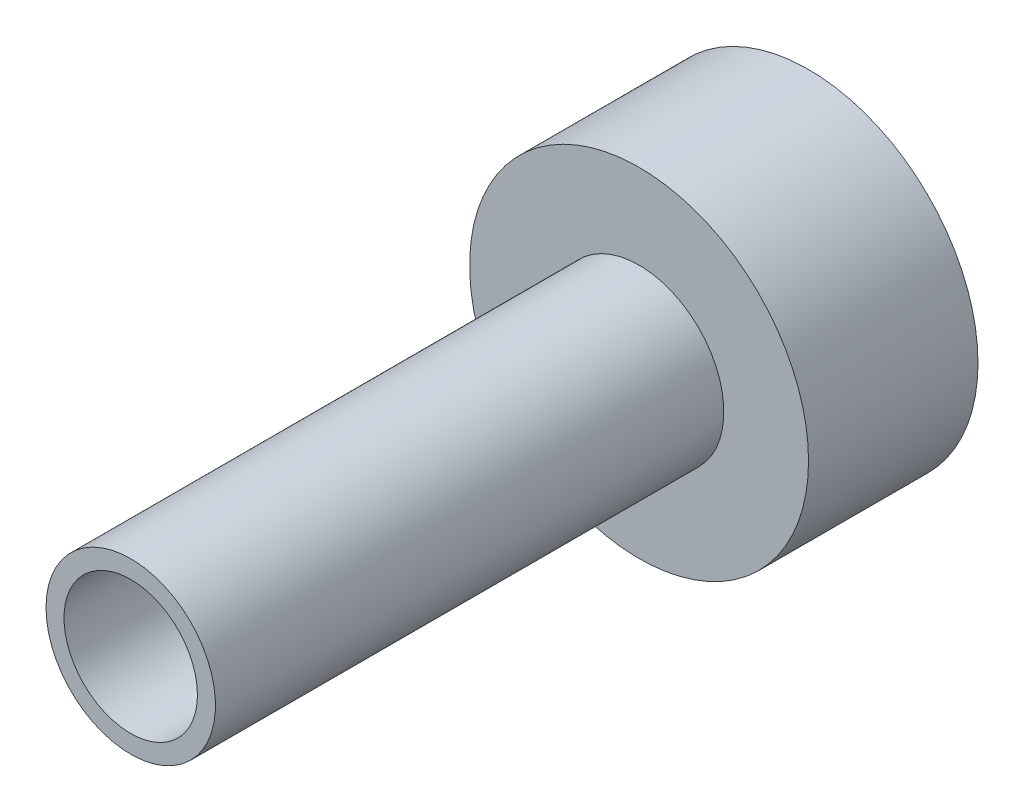
ISO-10303-21;
HEADER;
FILE_DESCRIPTION(('STEP AP214'),'2;1');
FILE_NAME('part.step','',(''),(''),'','','');
FILE_SCHEMA(('AUTOMOTIVE_DESIGN { 1 0 10303 214 1 1 1 1 }'));
ENDSEC;
DATA;
#1=APPLICATION_CONTEXT('core data for automotive mechanical design processes');
#2=APPLICATION_PROTOCOL_DEFINITION('international standard','automotive_design',2000,#1);
#3=PRODUCT_CONTEXT('',#1,'mechanical');
#4=PRODUCT('Part','Part','',(#3));
#5=PRODUCT_RELATED_PRODUCT_CATEGORY('part','',(#4));
#6=PRODUCT_DEFINITION_FORMATION('','',#4);
#7=PRODUCT_DEFINITION_CONTEXT('part definition',#1,'design');
#8=PRODUCT_DEFINITION('design','',#6,#7);
#9=PRODUCT_DEFINITION_SHAPE('','',#8);
#10=(LENGTH_UNIT() NAMED_UNIT(*) SI_UNIT(.MILLI.,.METRE.));
#11=(NAMED_UNIT(*) PLANE_ANGLE_UNIT() SI_UNIT($,.RADIAN.));
#12=(NAMED_UNIT(*) SI_UNIT($,.STERADIAN.) SOLID_ANGLE_UNIT());
#13=UNCERTAINTY_MEASURE_WITH_UNIT(LENGTH_MEASURE(1.E-05),#10,'distance_accuracy_value','');
#14=(GEOMETRIC_REPRESENTATION_CONTEXT(3) GLOBAL_UNCERTAINTY_ASSIGNED_CONTEXT((#13)) GLOBAL_UNIT_ASSIGNED_CONTEXT((#10,
#11,#12)) REPRESENTATION_CONTEXT('',''));
#15=CARTESIAN_POINT('',(0.,0.,0.));
#16=DIRECTION('',(0.,0.,1.));
#17=DIRECTION('',(1.,0.,0.));
#18=AXIS2_PLACEMENT_3D('',#15,#16,#17);
#19=CARTESIAN_POINT('',(0.,0.,6.35));
#20=DIRECTION('',(0.,0.,1.));
#21=DIRECTION('',(1.,0.,0.));
#22=AXIS2_PLACEMENT_3D('',#19,#20,#21);
#23=PLANE('',#22);
#24=CARTESIAN_POINT('',(0.,0.,6.35));
#25=DIRECTION('',(0.,0.,1.));
#26=DIRECTION('',(1.,0.,0.));
#27=AXIS2_PLACEMENT_3D('',#24,#25,#26);
#28=CIRCLE('',#27,6.35);
#29=CARTESIAN_POINT('',(6.35,0.,6.35));
#30=VERTEX_POINT('',#29);
#31=EDGE_CURVE('E46',#30,#30,#28,.T.);
#32=ORIENTED_EDGE('',*,*,#31,.T.);
#33=EDGE_LOOP('',(#32));
#34=FACE_BOUND('',#33,.T.);
#35=CARTESIAN_POINT('',(0.,0.,6.35));
#36=DIRECTION('',(0.,0.,1.));
#37=DIRECTION('',(1.,0.,0.));
#38=AXIS2_PLACEMENT_3D('',#35,#36,#37);
#39=CIRCLE('',#38,3.175);
#40=CARTESIAN_POINT('',(-3.175,0.,6.35));
#41=VERTEX_POINT('',#40);
#42=EDGE_CURVE('E60',#41,#41,#39,.T.);
#43=ORIENTED_EDGE('',*,*,#42,.F.);
#44=EDGE_LOOP('',(#43));
#45=FACE_BOUND('',#44,.T.);
#46=ADVANCED_FACE('F35',(#34,#45),#23,.T.);
#47=CARTESIAN_POINT('',(0.,0.,0.));
#48=DIRECTION('',(0.,0.,1.));
#49=DIRECTION('',(1.,0.,0.));
#50=AXIS2_PLACEMENT_3D('',#47,#48,#49);
#51=PLANE('',#50);
#52=CARTESIAN_POINT('',(0.,0.,0.));
#53=DIRECTION('',(0.,0.,1.));
#54=DIRECTION('',(1.,0.,0.));
#55=AXIS2_PLACEMENT_3D('',#52,#53,#54);
#56=CIRCLE('',#55,6.35);
#57=CARTESIAN_POINT('',(6.35,0.,0.));
#58=VERTEX_POINT('',#57);
#59=EDGE_CURVE('E50',#58,#58,#56,.T.);
#60=ORIENTED_EDGE('',*,*,#59,.F.);
#61=EDGE_LOOP('',(#60));
#62=FACE_BOUND('',#61,.T.);
#63=CARTESIAN_POINT('',(0.,0.,0.));
#64=DIRECTION('',(0.,0.,1.));
#65=DIRECTION('',(1.,0.,0.));
#66=AXIS2_PLACEMENT_3D('',#63,#64,#65);
#67=CIRCLE('',#66,2.5);
#68=CARTESIAN_POINT('',(2.5,0.,0.));
#69=VERTEX_POINT('',#68);
#70=EDGE_CURVE('E55',#69,#69,#67,.T.);
#71=ORIENTED_EDGE('',*,*,#70,.T.);
#72=EDGE_LOOP('',(#71));
#73=FACE_BOUND('',#72,.T.);
#74=ADVANCED_FACE('F94',(#62,#73),#51,.F.);
#75=CARTESIAN_POINT('',(0.,0.,6.35));
#76=DIRECTION('',(0.,0.,-1.));
#77=DIRECTION('',(-1.,0.,0.));
#78=AXIS2_PLACEMENT_3D('',#75,#76,#77);
#79=CYLINDRICAL_SURFACE('',#78,6.35);
#80=CARTESIAN_POINT('',(-6.35,0.,4.32190817375387));
#81=CARTESIAN_POINT('',(-6.3499988839214,-0.0629563878791096,4.32190570961263));
#82=CARTESIAN_POINT('',(-6.34905403128448,-0.125945518180089,4.31663050555598));
#83=CARTESIAN_POINT('',(-6.34537585531729,-0.250152702081869,4.29568038867684));
#84=CARTESIAN_POINT('',(-6.34264095902063,-0.31136914852081,4.27999632910353));
#85=CARTESIAN_POINT('',(-6.33568901554255,-0.430216353374725,4.23872073438084));
#86=CARTESIAN_POINT('',(-6.33147324821675,-0.48785015765638,4.21313775252846));
#87=CARTESIAN_POINT('',(-6.32202140996736,-0.598001091171562,4.15281393416416));
#88=CARTESIAN_POINT('',(-6.31678543757031,-0.650518713767407,4.11807398187448));
#89=CARTESIAN_POINT('',(-6.3058088163252,-0.749522216487122,4.04002211357387));
#90=CARTESIAN_POINT('',(-6.30006376112309,-0.795944583557266,3.99663024677148));
#91=CARTESIAN_POINT('',(-6.28874965760556,-0.880890742796282,3.90267833023243));
#92=CARTESIAN_POINT('',(-6.28318062121278,-0.919414000884793,3.85211779619324));
#93=CARTESIAN_POINT('',(-6.27280636489556,-0.987728082473348,3.74482077108546));
#94=CARTESIAN_POINT('',(-6.26800683286247,-1.01745513923004,3.68804308273011));
#95=CARTESIAN_POINT('',(-6.25977667220809,-1.0669249737415,3.57020006709602));
#96=CARTESIAN_POINT('',(-6.25634593766797,-1.08666852406106,3.50913507200331));
#97=CARTESIAN_POINT('',(-6.2512859511231,-1.11540879351234,3.38512755160419));
#98=CARTESIAN_POINT('',(-6.24963823052388,-1.12451576700911,3.32221134730215));
#99=CARTESIAN_POINT('',(-6.24827506974414,-1.13206641649241,3.19572400111501));
#100=CARTESIAN_POINT('',(-6.24855947354512,-1.13051095346756,3.13215291252554));
#101=CARTESIAN_POINT('',(-6.25101158981713,-1.11687047479473,3.00695358118695));
#102=CARTESIAN_POINT('',(-6.25315700585985,-1.10491011333064,2.94531125660436));
#103=CARTESIAN_POINT('',(-6.25905444840308,-1.07099533738572,2.82492235902611));
#104=CARTESIAN_POINT('',(-6.26280653702217,-1.049040536489,2.76617589809082));
#105=CARTESIAN_POINT('',(-6.2715182331776,-0.995636097085759,2.65287762972726));
#106=CARTESIAN_POINT('',(-6.27648429874685,-0.964135455052854,2.59835038042863));
#107=CARTESIAN_POINT('',(-6.28706003112924,-0.892569656940644,2.49530848978844));
#108=CARTESIAN_POINT('',(-6.29266975697482,-0.852503715015034,2.44679440078595));
#109=CARTESIAN_POINT('',(-6.3039982759432,-0.764269222158468,2.35643510913641));
#110=CARTESIAN_POINT('',(-6.30971748810976,-0.715993892439711,2.3146941568001));
#111=CARTESIAN_POINT('',(-6.32054731368641,-0.613070078093335,2.23988845968553));
#112=CARTESIAN_POINT('',(-6.32565792208253,-0.558421540967503,2.20682378638393));
#113=CARTESIAN_POINT('',(-6.33470353710574,-0.444198884642506,2.15029664891139));
#114=CARTESIAN_POINT('',(-6.33863730921633,-0.384619676136645,2.12684425867615));
#115=CARTESIAN_POINT('',(-6.34487632476616,-0.262282092255564,2.09030873282734));
#116=CARTESIAN_POINT('',(-6.34718172386837,-0.199524021375927,2.07722460605358));
#117=CARTESIAN_POINT('',(-6.34988306770141,-0.0735078508517706,2.06194034334128));
#118=CARTESIAN_POINT('',(-6.35030409228237,-0.0102676109126,2.05959724081418));
#119=CARTESIAN_POINT('',(-6.34925825163245,0.115701348621398,2.06547914491534));
#120=CARTESIAN_POINT('',(-6.34779146965248,0.17843009065015,2.07370368551821));
#121=CARTESIAN_POINT('',(-6.34315039678748,0.301147522772469,2.10036851617878));
#122=CARTESIAN_POINT('',(-6.33998807934095,0.361152264520321,2.11873719786243));
#123=CARTESIAN_POINT('',(-6.33230904006331,0.477230535073567,2.16509194347609));
#124=CARTESIAN_POINT('',(-6.32779223354356,0.533303817796236,2.19307860878086));
#125=CARTESIAN_POINT('',(-6.31784277068134,0.640542721018922,2.25819647381568));
#126=CARTESIAN_POINT('',(-6.31240144327334,0.691653918516031,2.29541594846123));
#127=CARTESIAN_POINT('',(-6.30123054524762,0.78695626008388,2.37782253373787));
#128=CARTESIAN_POINT('',(-6.29550095057328,0.831146825340834,2.42301031013437));
#129=CARTESIAN_POINT('',(-6.28431705815892,0.911890524213835,2.52071525694072));
#130=CARTESIAN_POINT('',(-6.27886684675114,0.948346537135833,2.57331323185442));
#131=CARTESIAN_POINT('',(-6.26893820466268,1.01190558831821,2.68397062891774));
#132=CARTESIAN_POINT('',(-6.2644597402094,1.03900895164483,2.74202986116337));
#133=CARTESIAN_POINT('',(-6.25701307344201,1.08295206493416,2.86170339315579));
#134=CARTESIAN_POINT('',(-6.25403806705126,1.09983812432205,2.9233002456087));
#135=CARTESIAN_POINT('',(-6.24991887731239,1.12301156564012,3.04851408924664));
#136=CARTESIAN_POINT('',(-6.24877450994984,1.12930001283747,3.11213087673367));
#137=CARTESIAN_POINT('',(-6.24845484979012,1.13106684825176,3.23860738945719));
#138=CARTESIAN_POINT('',(-6.24925168135855,1.12669827021579,3.30146495804851));
#139=CARTESIAN_POINT('',(-6.25266316282823,1.10760816297116,3.42553492981796));
#140=CARTESIAN_POINT('',(-6.25527780432067,1.09288668165289,3.4867473406049));
#141=CARTESIAN_POINT('',(-6.26201909575184,1.05357047523371,3.60571793427834));
#142=CARTESIAN_POINT('',(-6.26614345047997,1.02899073220675,3.66348120663358));
#143=CARTESIAN_POINT('',(-6.27544134328701,0.970671955669598,3.77408873184795));
#144=CARTESIAN_POINT('',(-6.28061494523719,0.936932364525778,3.82693268496544));
#145=CARTESIAN_POINT('',(-6.29151580295166,0.860712930365976,3.92697125118184));
#146=CARTESIAN_POINT('',(-6.29724959616527,0.818121129276667,3.97407986458786));
#147=CARTESIAN_POINT('',(-6.30857437800572,0.725641135508031,4.06053299191055));
#148=CARTESIAN_POINT('',(-6.31416533347806,0.675751266606113,4.09987571726529));
#149=CARTESIAN_POINT('',(-6.32462666894718,0.569614887399337,4.16997142935248));
#150=CARTESIAN_POINT('',(-6.32949092933148,0.513320736215191,4.20065321225178));
#151=CARTESIAN_POINT('',(-6.3378912214025,0.39631076881733,4.25207585492785));
#152=CARTESIAN_POINT('',(-6.34142853555049,0.335599289969209,4.27282631846293));
#153=CARTESIAN_POINT('',(-6.34603119498659,0.228901192837832,4.29944657052336));
#154=CARTESIAN_POINT('',(-6.3475113052666,0.183549007984973,4.30785570768228));
#155=CARTESIAN_POINT('',(-6.34949610579554,0.0921370516835602,4.31908735146152));
#156=CARTESIAN_POINT('',(-6.35000081684933,0.0460772953483361,4.32190997723986));
#157=CARTESIAN_POINT('',(-6.35,0.,4.32190817375387));
#158=B_SPLINE_CURVE_WITH_KNOTS('',3,(#80,#81,#82,#83,#84,#85,#86,#87,#88,#89,#90,#91,#92,#93,
#94,#95,#96,#97,#98,#99,#100,#101,#102,#103,#104,#105,#106,#107,#108,#109,#110,#111,#112,#113,
#114,#115,#116,#117,#118,#119,#120,#121,#122,#123,#124,#125,#126,#127,#128,#129,#130,#131,#132,
#133,#134,#135,#136,#137,#138,#139,#140,#141,#142,#143,#144,#145,#146,#147,#148,#149,#150,#151,
#152,#153,#154,#155,#156,#157),.UNSPECIFIED.,.T.,.F.,(4,2,2,2,2,2,2,2,2,2,2,2,2,2,2,2,2,2,2,2,2,
2,2,2,2,2,2,2,2,2,2,2,2,2,2,2,2,2,4),(0.,0.188700695089458,0.377567430304385,0.566271335794905,
0.754957026188634,0.945474674221974,1.13600519943006,1.32788488763882,1.51974972513488,
1.70960760659306,1.89945015726348,2.08704917225956,2.27465544102885,2.4632823148854,
2.65192650225096,2.84324403808116,3.03456314996839,3.22608225995457,3.41758305935036,
3.6065273740334,3.79546335669534,3.98308236329304,4.17071310310582,4.36021202617093,
4.5497267897079,4.74149628669667,4.93325911775941,5.1241461524447,5.31501399810743,
5.50315717677205,5.69129948513105,5.879156941514,6.06702583685678,6.25743369109013,
6.44788534712722,6.63985995513198,6.8316485433784,6.96976007448539,7.1078686596979),.UNSPECIFIED.);
#159=CARTESIAN_POINT('',(-6.35,0.,4.32190817375387));
#160=VERTEX_POINT('',#159);
#161=EDGE_CURVE('E10',#160,#160,#158,.T.);
#162=ORIENTED_EDGE('',*,*,#161,.T.);
#163=EDGE_LOOP('',(#162));
#164=FACE_BOUND('',#163,.T.);
#165=ORIENTED_EDGE('',*,*,#31,.F.);
#166=EDGE_LOOP('',(#165));
#167=FACE_BOUND('',#166,.T.);
#168=ORIENTED_EDGE('',*,*,#59,.T.);
#169=EDGE_LOOP('',(#168));
#170=FACE_BOUND('',#169,.T.);
#171=ADVANCED_FACE('F37',(#164,#167,#170),#79,.T.);
#172=CARTESIAN_POINT('',(0.,0.,6.35));
#173=DIRECTION('',(0.,0.,-1.));
#174=DIRECTION('',(-1.,0.,0.));
#175=AXIS2_PLACEMENT_3D('',#172,#173,#174);
#176=CYLINDRICAL_SURFACE('',#175,2.5);
#177=CARTESIAN_POINT('',(-2.5,0.,4.32190817375387));
#178=CARTESIAN_POINT('',(-2.49999753532052,-0.0600822781699421,4.32190519010651));
#179=CARTESIAN_POINT('',(-2.49780998569268,-0.120255579793321,4.31708934999698));
#180=CARTESIAN_POINT('',(-2.48927659139313,-0.238864936200406,4.29801966384634));
#181=CARTESIAN_POINT('',(-2.48292101568391,-0.297296590206035,4.28374373062889));
#182=CARTESIAN_POINT('',(-2.46672504100596,-0.410519737980339,4.24640262474459));
#183=CARTESIAN_POINT('',(-2.45689724977841,-0.465323560820436,4.22336922800749));
#184=CARTESIAN_POINT('',(-2.43469105852836,-0.570226447848531,4.16931185872671));
#185=CARTESIAN_POINT('',(-2.42231318685542,-0.620326483486105,4.13828954107022));
#186=CARTESIAN_POINT('',(-2.39542952734409,-0.717343781540012,4.06727692519043));
#187=CARTESIAN_POINT('',(-2.38084643173633,-0.763958808348631,4.02690331522822));
#188=CARTESIAN_POINT('',(-2.35149528944333,-0.85002441305893,3.93914926029241));
#189=CARTESIAN_POINT('',(-2.33672713461405,-0.889470570876482,3.89176452493358));
#190=CARTESIAN_POINT('',(-2.30766976105589,-0.962442756535043,3.7878865205287));
#191=CARTESIAN_POINT('',(-2.29346302025365,-0.995468844501712,3.73101645276735));
#192=CARTESIAN_POINT('',(-2.26839208577814,-1.05135258954231,3.61180105394154));
#193=CARTESIAN_POINT('',(-2.25752587849092,-1.07421637599037,3.54945905051372));
#194=CARTESIAN_POINT('',(-2.24121806115519,-1.10782476642698,3.42453796049981));
#195=CARTESIAN_POINT('',(-2.2355162032548,-1.11915487795904,3.36215183942219));
#196=CARTESIAN_POINT('',(-2.22945167708961,-1.1311921664553,3.2361239151627));
#197=CARTESIAN_POINT('',(-2.22908524805582,-1.13190682591099,3.17248302811167));
#198=CARTESIAN_POINT('',(-2.23351683738998,-1.12312848632354,3.05210850312616));
#199=CARTESIAN_POINT('',(-2.23783618785691,-1.11458166981261,2.9952844200852));
#200=CARTESIAN_POINT('',(-2.25033149246957,-1.08913130633431,2.88398601822338));
#201=CARTESIAN_POINT('',(-2.25850835374474,-1.07222579369702,2.82951225539253));
#202=CARTESIAN_POINT('',(-2.27798715558767,-1.03020341851955,2.7229781944985));
#203=CARTESIAN_POINT('',(-2.28935580707384,-1.00490890992585,2.67100072538614));
#204=CARTESIAN_POINT('',(-2.31392853665228,-0.946955134909239,2.57180380481031));
#205=CARTESIAN_POINT('',(-2.3271333978298,-0.914292722591361,2.52458639826138));
#206=CARTESIAN_POINT('',(-2.3555119211023,-0.838661167836849,2.43122030766581));
#207=CARTESIAN_POINT('',(-2.37074960054508,-0.794983554799028,2.3856631791026));
#208=CARTESIAN_POINT('',(-2.40036815772633,-0.700488055365266,2.3023018525865));
#209=CARTESIAN_POINT('',(-2.41474875734216,-0.649667868974443,2.26450016166099));
#210=CARTESIAN_POINT('',(-2.441595329966,-0.540258539490566,2.19663624599657));
#211=CARTESIAN_POINT('',(-2.45398660301872,-0.481474906305864,2.16685575397384));
#212=CARTESIAN_POINT('',(-2.4748626594719,-0.359027896950457,2.1178212427441));
#213=CARTESIAN_POINT('',(-2.48334999142515,-0.295367736011091,2.09856035463438));
#214=CARTESIAN_POINT('',(-2.49495947814047,-0.169881134337021,2.07244478053609));
#215=CARTESIAN_POINT('',(-2.49842301024102,-0.10825106057275,2.06479882868542));
#216=CARTESIAN_POINT('',(-2.50071674189136,0.0155054827584758,2.05972085475632));
#217=CARTESIAN_POINT('',(-2.49954858951989,0.0776317679084565,2.06228519957925));
#218=CARTESIAN_POINT('',(-2.49292468795018,0.196637407064394,2.07702778069765));
#219=CARTESIAN_POINT('',(-2.48773299827167,0.25360660526838,2.08861412955853));
#220=CARTESIAN_POINT('',(-2.47388829633388,0.364708953054158,2.12020615681207));
#221=CARTESIAN_POINT('',(-2.46523486864258,0.418841761367811,2.14021284571758));
#222=CARTESIAN_POINT('',(-2.44494100839571,0.524649476351218,2.18870559194826));
#223=CARTESIAN_POINT('',(-2.43321610703453,0.576195720898968,2.21743583748114));
#224=CARTESIAN_POINT('',(-2.40798300337697,0.673920744470044,2.28229406571106));
#225=CARTESIAN_POINT('',(-2.39447402094728,0.72009715869568,2.31842528849773));
#226=CARTESIAN_POINT('',(-2.365711336932,0.809820978251054,2.40055360346166));
#227=CARTESIAN_POINT('',(-2.35040593918311,0.852830990637241,2.44712105848629));
#228=CARTESIAN_POINT('',(-2.32070956290476,0.930615104407229,2.54698320310193));
#229=CARTESIAN_POINT('',(-2.30631894715077,0.965385953108912,2.60028053684914));
#230=CARTESIAN_POINT('',(-2.27978800760565,1.0265035925915,2.71396852220422));
#231=CARTESIAN_POINT('',(-2.26771717388814,1.05260357478991,2.77450936616503));
#232=CARTESIAN_POINT('',(-2.24805111549491,1.09398365543882,2.899851817901));
#233=CARTESIAN_POINT('',(-2.24045131482283,1.10927481970081,2.96464899362599));
#234=CARTESIAN_POINT('',(-2.23137234406808,1.12741784093358,3.09061722594103));
#235=CARTESIAN_POINT('',(-2.22941953274959,1.13123346685628,3.1516154203954));
#236=CARTESIAN_POINT('',(-2.23056169824744,1.12898055369407,3.27337343592874));
#237=CARTESIAN_POINT('',(-2.23365549278361,1.12291432965375,3.33413330949713));
#238=CARTESIAN_POINT('',(-2.24407859716409,1.10192249763591,3.44961768807222));
#239=CARTESIAN_POINT('',(-2.25112244914719,1.08759230069689,3.50447893194039));
#240=CARTESIAN_POINT('',(-2.26838018341276,1.05112132051272,3.61100540452354));
#241=CARTESIAN_POINT('',(-2.27859499046872,1.02897825847537,3.66266969560457));
#242=CARTESIAN_POINT('',(-2.3018625679474,0.975868743486251,3.76501499748917));
#243=CARTESIAN_POINT('',(-2.31505655938752,0.944422675042858,3.81541426710497));
#244=CARTESIAN_POINT('',(-2.34247247324534,0.874209588312668,3.91051912175575));
#245=CARTESIAN_POINT('',(-2.35669484178566,0.835439380820094,3.95522221220731));
#246=CARTESIAN_POINT('',(-2.38613100197327,0.747475338300104,4.04190938965517));
#247=CARTESIAN_POINT('',(-2.40131593750279,0.697651312674878,4.08326705776534));
#248=CARTESIAN_POINT('',(-2.42970215828352,0.591249054874763,4.1571106183538));
#249=CARTESIAN_POINT('',(-2.44290252702554,0.534667723564207,4.18959241742027));
#250=CARTESIAN_POINT('',(-2.46574755679697,0.416728451415863,4.24427212982793));
#251=CARTESIAN_POINT('',(-2.47542460250943,0.355420635337768,4.26656421425028));
#252=CARTESIAN_POINT('',(-2.49024775142017,0.229471002212837,4.30027624327833));
#253=CARTESIAN_POINT('',(-2.49540756097344,0.164839905116673,4.31172908532248));
#254=CARTESIAN_POINT('',(-2.49867280408139,0.0831472137592143,4.31896957281664));
#255=CARTESIAN_POINT('',(-2.49916960292581,0.0665428536369055,4.32007046599491));
#256=CARTESIAN_POINT('',(-2.49983354479593,0.0332946596830815,4.32154018520103));
#257=CARTESIAN_POINT('',(-2.50000068304579,0.0166508252831944,4.32190900062316));
#258=CARTESIAN_POINT('',(-2.5,0.,4.32190817375387));
#259=B_SPLINE_CURVE_WITH_KNOTS('',3,(#177,#178,#179,#180,#181,#182,#183,#184,#185,#186,#187,
#188,#189,#190,#191,#192,#193,#194,#195,#196,#197,#198,#199,#200,#201,#202,#203,#204,#205,#206,
#207,#208,#209,#210,#211,#212,#213,#214,#215,#216,#217,#218,#219,#220,#221,#222,#223,#224,#225,
#226,#227,#228,#229,#230,#231,#232,#233,#234,#235,#236,#237,#238,#239,#240,#241,#242,#243,#244,
#245,#246,#247,#248,#249,#250,#251,#252,#253,#254,#255,#256,#257,#258),.UNSPECIFIED.,.T.,.F.,(4,
2,2,2,2,2,2,2,2,2,2,2,2,2,2,2,2,2,2,2,2,2,2,2,2,2,2,2,2,2,2,2,2,2,2,2,2,2,2,2,4),(0.,
0.18017852828696,0.360779221863851,0.540730775548947,0.720645082613014,0.909941937909636,
1.0993551142356,1.30018149963434,1.50088659203675,1.69080053665015,1.88058061066137,
2.05265365697005,2.22476718803771,2.40078676336934,2.57688163701786,2.77079443678603,
2.96476982249504,3.1648636881861,3.36482674348611,3.55043670236245,3.73598062211844,
3.91028304037042,4.08460638237139,4.26434709700547,4.44416666953937,4.63893005127565,
4.83377019466564,5.03375752759587,5.23353982053461,5.41599643659577,5.59841031425673,
5.7690822652223,5.9398040375847,6.1216126623015,6.30350063657832,6.50208743663037,
6.70076566782372,6.89756866886194,7.0937724328905,7.14370525540411,7.19363880129602),.UNSPECIFIED.);
#260=CARTESIAN_POINT('',(-2.5,0.,4.32190817375387));
#261=VERTEX_POINT('',#260);
#262=EDGE_CURVE('E68',#261,#261,#259,.T.);
#263=ORIENTED_EDGE('',*,*,#262,.F.);
#264=EDGE_LOOP('',(#263));
#265=FACE_BOUND('',#264,.T.);
#266=ORIENTED_EDGE('',*,*,#70,.F.);
#267=EDGE_LOOP('',(#266));
#268=FACE_BOUND('',#267,.T.);
#269=CARTESIAN_POINT('',(0.,0.,25.4));
#270=DIRECTION('',(0.,0.,1.));
#271=DIRECTION('',(1.,0.,0.));
#272=AXIS2_PLACEMENT_3D('',#269,#270,#271);
#273=CIRCLE('',#272,2.5);
#274=CARTESIAN_POINT('',(2.5,0.,25.4));
#275=VERTEX_POINT('',#274);
#276=EDGE_CURVE('E63',#275,#275,#273,.T.);
#277=ORIENTED_EDGE('',*,*,#276,.T.);
#278=EDGE_LOOP('',(#277));
#279=FACE_BOUND('',#278,.T.);
#280=ADVANCED_FACE('F73',(#265,#268,#279),#176,.F.);
#281=CARTESIAN_POINT('',(0.,0.,25.4));
#282=DIRECTION('',(0.,0.,1.));
#283=DIRECTION('',(1.,0.,0.));
#284=AXIS2_PLACEMENT_3D('',#281,#282,#283);
#285=PLANE('',#284);
#286=CARTESIAN_POINT('',(0.,0.,25.4));
#287=DIRECTION('',(0.,0.,1.));
#288=DIRECTION('',(1.,0.,0.));
#289=AXIS2_PLACEMENT_3D('',#286,#287,#288);
#290=CIRCLE('',#289,3.175);
#291=CARTESIAN_POINT('',(-3.175,0.,25.4));
#292=VERTEX_POINT('',#291);
#293=EDGE_CURVE('E59',#292,#292,#290,.T.);
#294=ORIENTED_EDGE('',*,*,#293,.T.);
#295=EDGE_LOOP('',(#294));
#296=FACE_BOUND('',#295,.T.);
#297=ORIENTED_EDGE('',*,*,#276,.F.);
#298=EDGE_LOOP('',(#297));
#299=FACE_BOUND('',#298,.T.);
#300=ADVANCED_FACE('F83',(#296,#299),#285,.T.);
#301=CARTESIAN_POINT('',(0.,0.,25.4));
#302=DIRECTION('',(0.,0.,-1.));
#303=DIRECTION('',(-1.,0.,0.));
#304=AXIS2_PLACEMENT_3D('',#301,#302,#303);
#305=CYLINDRICAL_SURFACE('',#304,3.175);
#306=CARTESIAN_POINT('',(-3.175,0.,25.4));
#307=CARTESIAN_POINT('',(-3.175,0.,25.2015625));
#308=CARTESIAN_POINT('',(-3.175,0.,25.003125));
#309=CARTESIAN_POINT('',(-3.175,0.,24.60625));
#310=CARTESIAN_POINT('',(-3.175,0.,24.4078125));
#311=CARTESIAN_POINT('',(-3.175,0.,24.0109375));
#312=CARTESIAN_POINT('',(-3.175,0.,23.8125));
#313=CARTESIAN_POINT('',(-3.175,0.,23.415625));
#314=CARTESIAN_POINT('',(-3.175,0.,23.2171875));
#315=CARTESIAN_POINT('',(-3.175,0.,22.8203125));
#316=CARTESIAN_POINT('',(-3.175,0.,22.621875));
#317=CARTESIAN_POINT('',(-3.175,0.,22.225));
#318=CARTESIAN_POINT('',(-3.175,0.,22.0265625));
#319=CARTESIAN_POINT('',(-3.175,0.,21.6296875));
#320=CARTESIAN_POINT('',(-3.175,0.,21.43125));
#321=CARTESIAN_POINT('',(-3.175,0.,21.034375));
#322=CARTESIAN_POINT('',(-3.175,0.,20.8359375));
#323=CARTESIAN_POINT('',(-3.175,0.,20.4390625));
#324=CARTESIAN_POINT('',(-3.175,0.,20.240625));
#325=CARTESIAN_POINT('',(-3.175,0.,19.84375));
#326=CARTESIAN_POINT('',(-3.175,0.,19.6453125));
#327=CARTESIAN_POINT('',(-3.175,0.,19.2484375));
#328=CARTESIAN_POINT('',(-3.175,0.,19.05));
#329=CARTESIAN_POINT('',(-3.175,0.,18.653125));
#330=CARTESIAN_POINT('',(-3.175,0.,18.4546875));
#331=CARTESIAN_POINT('',(-3.175,0.,18.0578125));
#332=CARTESIAN_POINT('',(-3.175,0.,17.859375));
#333=CARTESIAN_POINT('',(-3.175,0.,17.4625));
#334=CARTESIAN_POINT('',(-3.175,0.,17.2640625));
#335=CARTESIAN_POINT('',(-3.175,0.,16.8671875));
#336=CARTESIAN_POINT('',(-3.175,0.,16.66875));
#337=CARTESIAN_POINT('',(-3.175,0.,16.271875));
#338=CARTESIAN_POINT('',(-3.175,0.,16.0734375));
#339=CARTESIAN_POINT('',(-3.175,0.,15.6765625));
#340=CARTESIAN_POINT('',(-3.175,0.,15.478125));
#341=CARTESIAN_POINT('',(-3.175,0.,15.08125));
#342=CARTESIAN_POINT('',(-3.175,0.,14.8828125));
#343=CARTESIAN_POINT('',(-3.175,0.,14.4859375));
#344=CARTESIAN_POINT('',(-3.175,0.,14.2875));
#345=CARTESIAN_POINT('',(-3.175,0.,13.890625));
#346=CARTESIAN_POINT('',(-3.175,0.,13.6921875));
#347=CARTESIAN_POINT('',(-3.175,0.,13.2953125));
#348=CARTESIAN_POINT('',(-3.175,0.,13.096875));
#349=CARTESIAN_POINT('',(-3.175,0.,12.7));
#350=CARTESIAN_POINT('',(-3.175,0.,12.5015625));
#351=CARTESIAN_POINT('',(-3.175,0.,12.1046875));
#352=CARTESIAN_POINT('',(-3.175,0.,11.90625));
#353=CARTESIAN_POINT('',(-3.175,0.,11.509375));
#354=CARTESIAN_POINT('',(-3.175,0.,11.3109375));
#355=CARTESIAN_POINT('',(-3.175,0.,10.9140625));
#356=CARTESIAN_POINT('',(-3.175,0.,10.715625));
#357=CARTESIAN_POINT('',(-3.175,0.,10.31875));
#358=CARTESIAN_POINT('',(-3.175,0.,10.1203125));
#359=CARTESIAN_POINT('',(-3.175,0.,9.7234375));
#360=CARTESIAN_POINT('',(-3.175,0.,9.525));
#361=CARTESIAN_POINT('',(-3.175,0.,9.128125));
#362=CARTESIAN_POINT('',(-3.175,0.,8.9296875));
#363=CARTESIAN_POINT('',(-3.175,0.,8.5328125));
#364=CARTESIAN_POINT('',(-3.175,0.,8.334375));
#365=CARTESIAN_POINT('',(-3.175,0.,7.9375));
#366=CARTESIAN_POINT('',(-3.175,0.,7.7390625));
#367=CARTESIAN_POINT('',(-3.175,0.,7.3421875));
#368=CARTESIAN_POINT('',(-3.175,0.,7.14375));
#369=CARTESIAN_POINT('',(-3.175,0.,6.746875));
#370=CARTESIAN_POINT('',(-3.175,0.,6.5484375));
#371=CARTESIAN_POINT('',(-3.175,0.,6.35));
#372=B_SPLINE_CURVE_WITH_KNOTS('',3,(#306,#307,#308,#309,#310,#311,#312,#313,#314,#315,#316,
#317,#318,#319,#320,#321,#322,#323,#324,#325,#326,#327,#328,#329,#330,#331,#332,#333,#334,#335,
#336,#337,#338,#339,#340,#341,#342,#343,#344,#345,#346,#347,#348,#349,#350,#351,#352,#353,#354,
#355,#356,#357,#358,#359,#360,#361,#362,#363,#364,#365,#366,#367,#368,#369,#370,#371),
.UNSPECIFIED.,.F.,.F.,(4,2,2,2,2,2,2,2,2,2,2,2,2,2,2,2,2,2,2,2,2,2,2,2,2,2,2,2,2,2,2,2,4),(0.,
0.595312499999997,1.190625,1.7859375,2.38125,2.9765625,3.571875,4.1671875,4.7625,5.3578125,
5.953125,6.5484375,7.14375,7.7390625,8.33437499999999,8.92968749999999,9.525,10.1203125,
10.715625,11.3109375,11.90625,12.5015625,13.096875,13.6921875,14.2875,14.8828125,15.478125,
16.0734375,16.66875,17.2640625,17.859375,18.4546875,19.05),.UNSPECIFIED.);
#373=EDGE_CURVE('BSEAM81',#292,#41,#372,.T.);
#374=ORIENTED_EDGE('',*,*,#293,.F.);
#375=ORIENTED_EDGE('',*,*,#42,.T.);
#376=ORIENTED_EDGE('',*,*,#373,.T.);
#377=ORIENTED_EDGE('',*,*,#373,.F.);
#378=EDGE_LOOP('',(#374,#376,#375,#377));
#379=FACE_BOUND('',#378,.T.);
#380=ADVANCED_FACE('F81',(#379),#305,.T.);
#381=CARTESIAN_POINT('',(-6.35,0.,3.19160817375387));
#382=DIRECTION('',(-1.,0.,0.));
#383=DIRECTION('',(0.,0.,1.));
#384=AXIS2_PLACEMENT_3D('',#381,#382,#383);
#385=CYLINDRICAL_SURFACE('',#384,1.13029999999999);
#386=ORIENTED_EDGE('',*,*,#262,.T.);
#387=EDGE_LOOP('',(#386));
#388=FACE_BOUND('',#387,.T.);
#389=ORIENTED_EDGE('',*,*,#161,.F.);
#390=EDGE_LOOP('',(#389));
#391=FACE_BOUND('',#390,.T.);
#392=ADVANCED_FACE('F77',(#388,#391),#385,.F.);
#393=CLOSED_SHELL('',(#46,#74,#171,#280,#300,#380,#392));
#394=MANIFOLD_SOLID_BREP('B2',#393);
#395=ADVANCED_BREP_SHAPE_REPRESENTATION('',(#18,#394),#14);
#396=SHAPE_DEFINITION_REPRESENTATION(#9,#395);
ENDSEC;
END-ISO-10303-21;
